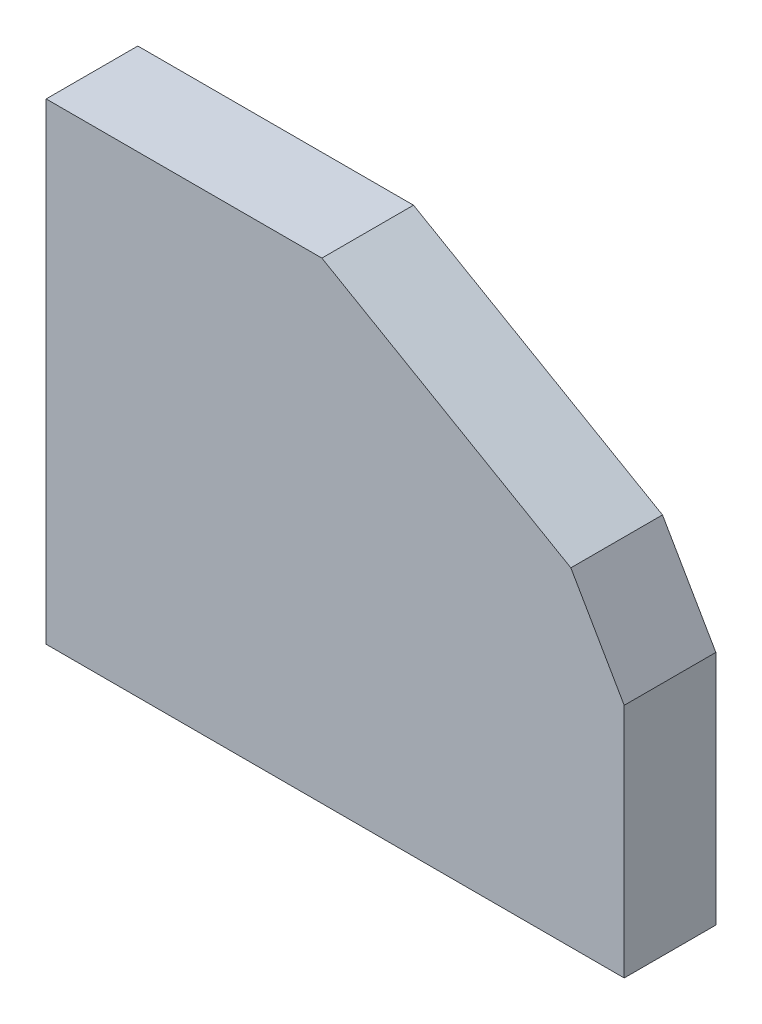
ISO-10303-21;
HEADER;
FILE_DESCRIPTION(('STEP AP214'),'2;1');
FILE_NAME('part.step','',(''),(''),'','','');
FILE_SCHEMA(('AUTOMOTIVE_DESIGN { 1 0 10303 214 1 1 1 1 }'));
ENDSEC;
DATA;
#1=APPLICATION_CONTEXT('core data for automotive mechanical design processes');
#2=APPLICATION_PROTOCOL_DEFINITION('international standard','automotive_design',2000,#1);
#3=PRODUCT_CONTEXT('',#1,'mechanical');
#4=PRODUCT('Part','Part','',(#3));
#5=PRODUCT_RELATED_PRODUCT_CATEGORY('part','',(#4));
#6=PRODUCT_DEFINITION_FORMATION('','',#4);
#7=PRODUCT_DEFINITION_CONTEXT('part definition',#1,'design');
#8=PRODUCT_DEFINITION('design','',#6,#7);
#9=PRODUCT_DEFINITION_SHAPE('','',#8);
#10=(LENGTH_UNIT() NAMED_UNIT(*) SI_UNIT(.MILLI.,.METRE.));
#11=(NAMED_UNIT(*) PLANE_ANGLE_UNIT() SI_UNIT($,.RADIAN.));
#12=(NAMED_UNIT(*) SI_UNIT($,.STERADIAN.) SOLID_ANGLE_UNIT());
#13=UNCERTAINTY_MEASURE_WITH_UNIT(LENGTH_MEASURE(1.E-05),#10,'distance_accuracy_value','');
#14=(GEOMETRIC_REPRESENTATION_CONTEXT(3) GLOBAL_UNCERTAINTY_ASSIGNED_CONTEXT((#13)) GLOBAL_UNIT_ASSIGNED_CONTEXT((#10,
#11,#12)) REPRESENTATION_CONTEXT('',''));
#15=CARTESIAN_POINT('',(0.,0.,0.));
#16=DIRECTION('',(0.,0.,1.));
#17=DIRECTION('',(1.,0.,0.));
#18=AXIS2_PLACEMENT_3D('',#15,#16,#17);
#19=CARTESIAN_POINT('',(41.,-33.5,13.));
#20=DIRECTION('',(-1.,0.,0.));
#21=DIRECTION('',(0.,-1.,0.));
#22=AXIS2_PLACEMENT_3D('',#19,#20,#21);
#23=PLANE('',#22);
#24=DIRECTION('',(0.,1.,0.));
#25=VECTOR('',#24,1.);
#26=CARTESIAN_POINT('',(41.,-33.5,0.));
#27=LINE('',#26,#25);
#28=CARTESIAN_POINT('',(41.,-33.5,0.));
#29=VERTEX_POINT('',#28);
#30=CARTESIAN_POINT('',(41.,0.,0.));
#31=VERTEX_POINT('',#30);
#32=EDGE_CURVE('E115',#29,#31,#27,.T.);
#33=ORIENTED_EDGE('',*,*,#32,.T.);
#34=DIRECTION('',(0.,0.,-1.));
#35=VECTOR('',#34,1.);
#36=CARTESIAN_POINT('',(41.,0.,13.));
#37=LINE('',#36,#35);
#38=CARTESIAN_POINT('',(41.,0.,13.));
#39=VERTEX_POINT('',#38);
#40=EDGE_CURVE('E11',#39,#31,#37,.T.);
#41=ORIENTED_EDGE('',*,*,#40,.F.);
#42=DIRECTION('',(0.,1.,0.));
#43=VECTOR('',#42,1.);
#44=CARTESIAN_POINT('',(41.,-33.5,13.));
#45=LINE('',#44,#43);
#46=CARTESIAN_POINT('',(41.,-33.5,13.));
#47=VERTEX_POINT('',#46);
#48=EDGE_CURVE('E80',#47,#39,#45,.T.);
#49=ORIENTED_EDGE('',*,*,#48,.F.);
#50=DIRECTION('',(0.,0.,-1.));
#51=VECTOR('',#50,1.);
#52=CARTESIAN_POINT('',(41.,-33.5,13.));
#53=LINE('',#52,#51);
#54=EDGE_CURVE('E49',#47,#29,#53,.T.);
#55=ORIENTED_EDGE('',*,*,#54,.T.);
#56=EDGE_LOOP('',(#33,#41,#49,#55));
#57=FACE_BOUND('',#56,.T.);
#58=ADVANCED_FACE('F33',(#57),#23,.F.);
#59=CARTESIAN_POINT('',(33.431867575506,13.1083898776333,13.));
#60=DIRECTION('',(0.866025403784442,0.499999999999995,0.));
#61=DIRECTION('',(-0.499999999999995,0.866025403784442,0.));
#62=AXIS2_PLACEMENT_3D('',#59,#60,#61);
#63=PLANE('',#62);
#64=DIRECTION('',(0.499999999999995,-0.866025403784442,0.));
#65=VECTOR('',#64,1.);
#66=CARTESIAN_POINT('',(33.431867575506,13.1083898776333,0.));
#67=LINE('',#66,#65);
#68=CARTESIAN_POINT('',(33.431867575506,13.1083898776333,0.));
#69=VERTEX_POINT('',#68);
#70=EDGE_CURVE('E117',#69,#31,#67,.T.);
#71=ORIENTED_EDGE('',*,*,#70,.F.);
#72=DIRECTION('',(0.,0.,-1.));
#73=VECTOR('',#72,1.);
#74=CARTESIAN_POINT('',(33.431867575506,13.1083898776333,13.));
#75=LINE('',#74,#73);
#76=CARTESIAN_POINT('',(33.431867575506,13.1083898776333,13.));
#77=VERTEX_POINT('',#76);
#78=EDGE_CURVE('E41',#77,#69,#75,.T.);
#79=ORIENTED_EDGE('',*,*,#78,.F.);
#80=DIRECTION('',(0.499999999999995,-0.866025403784442,0.));
#81=VECTOR('',#80,1.);
#82=CARTESIAN_POINT('',(33.431867575506,13.1083898776333,13.));
#83=LINE('',#82,#81);
#84=EDGE_CURVE('E154',#77,#39,#83,.T.);
#85=ORIENTED_EDGE('',*,*,#84,.T.);
#86=ORIENTED_EDGE('',*,*,#40,.T.);
#87=EDGE_LOOP('',(#71,#79,#85,#86));
#88=FACE_BOUND('',#87,.T.);
#89=ADVANCED_FACE('F137',(#88),#63,.T.);
#90=CARTESIAN_POINT('',(-1.88743720456944,33.5,13.));
#91=DIRECTION('',(0.499999999999995,0.866025403784442,0.));
#92=DIRECTION('',(-0.866025403784442,0.499999999999995,0.));
#93=AXIS2_PLACEMENT_3D('',#90,#91,#92);
#94=PLANE('',#93);
#95=DIRECTION('',(0.866025403784442,-0.499999999999995,0.));
#96=VECTOR('',#95,1.);
#97=CARTESIAN_POINT('',(-1.88743720456944,33.5,0.));
#98=LINE('',#97,#96);
#99=CARTESIAN_POINT('',(-1.88743720456944,33.5,0.));
#100=VERTEX_POINT('',#99);
#101=EDGE_CURVE('E120',#100,#69,#98,.T.);
#102=ORIENTED_EDGE('',*,*,#101,.F.);
#103=DIRECTION('',(0.,0.,-1.));
#104=VECTOR('',#103,1.);
#105=CARTESIAN_POINT('',(-1.88743720456944,33.5,13.));
#106=LINE('',#105,#104);
#107=CARTESIAN_POINT('',(-1.88743720456944,33.5,13.));
#108=VERTEX_POINT('',#107);
#109=EDGE_CURVE('E107',#108,#100,#106,.T.);
#110=ORIENTED_EDGE('',*,*,#109,.F.);
#111=DIRECTION('',(0.866025403784442,-0.499999999999995,0.));
#112=VECTOR('',#111,1.);
#113=CARTESIAN_POINT('',(-1.88743720456944,33.5,13.));
#114=LINE('',#113,#112);
#115=EDGE_CURVE('E97',#108,#77,#114,.T.);
#116=ORIENTED_EDGE('',*,*,#115,.T.);
#117=ORIENTED_EDGE('',*,*,#78,.T.);
#118=EDGE_LOOP('',(#102,#110,#116,#117));
#119=FACE_BOUND('',#118,.T.);
#120=ADVANCED_FACE('F134',(#119),#94,.T.);
#121=CARTESIAN_POINT('',(-1.88743720456944,33.5,13.));
#122=DIRECTION('',(0.,-1.,0.));
#123=DIRECTION('',(0.,0.,-1.));
#124=AXIS2_PLACEMENT_3D('',#121,#122,#123);
#125=PLANE('',#124);
#126=DIRECTION('',(-1.,0.,0.));
#127=VECTOR('',#126,1.);
#128=CARTESIAN_POINT('',(-1.88743720456944,33.5,0.));
#129=LINE('',#128,#127);
#130=CARTESIAN_POINT('',(-41.,33.5,0.));
#131=VERTEX_POINT('',#130);
#132=EDGE_CURVE('E104',#100,#131,#129,.T.);
#133=ORIENTED_EDGE('',*,*,#132,.T.);
#134=DIRECTION('',(0.,0.,-1.));
#135=VECTOR('',#134,1.);
#136=CARTESIAN_POINT('',(-41.,33.5,13.));
#137=LINE('',#136,#135);
#138=CARTESIAN_POINT('',(-41.,33.5,13.));
#139=VERTEX_POINT('',#138);
#140=EDGE_CURVE('E101',#139,#131,#137,.T.);
#141=ORIENTED_EDGE('',*,*,#140,.F.);
#142=DIRECTION('',(-1.,0.,0.));
#143=VECTOR('',#142,1.);
#144=CARTESIAN_POINT('',(-1.88743720456944,33.5,13.));
#145=LINE('',#144,#143);
#146=EDGE_CURVE('E91',#108,#139,#145,.T.);
#147=ORIENTED_EDGE('',*,*,#146,.F.);
#148=ORIENTED_EDGE('',*,*,#109,.T.);
#149=EDGE_LOOP('',(#133,#141,#147,#148));
#150=FACE_BOUND('',#149,.T.);
#151=ADVANCED_FACE('F102',(#150),#125,.F.);
#152=CARTESIAN_POINT('',(-41.,-33.5,13.));
#153=DIRECTION('',(-1.,0.,0.));
#154=DIRECTION('',(0.,0.,1.));
#155=AXIS2_PLACEMENT_3D('',#152,#153,#154);
#156=PLANE('',#155);
#157=DIRECTION('',(0.,1.,0.));
#158=VECTOR('',#157,1.);
#159=CARTESIAN_POINT('',(-41.,-33.5,0.));
#160=LINE('',#159,#158);
#161=CARTESIAN_POINT('',(-41.,-33.5,0.));
#162=VERTEX_POINT('',#161);
#163=EDGE_CURVE('E124',#162,#131,#160,.T.);
#164=ORIENTED_EDGE('',*,*,#163,.F.);
#165=DIRECTION('',(0.,0.,-1.));
#166=VECTOR('',#165,1.);
#167=CARTESIAN_POINT('',(-41.,-33.5,13.));
#168=LINE('',#167,#166);
#169=CARTESIAN_POINT('',(-41.,-33.5,13.));
#170=VERTEX_POINT('',#169);
#171=EDGE_CURVE('E68',#170,#162,#168,.T.);
#172=ORIENTED_EDGE('',*,*,#171,.F.);
#173=DIRECTION('',(0.,1.,0.));
#174=VECTOR('',#173,1.);
#175=CARTESIAN_POINT('',(-41.,-33.5,13.));
#176=LINE('',#175,#174);
#177=EDGE_CURVE('E95',#170,#139,#176,.T.);
#178=ORIENTED_EDGE('',*,*,#177,.T.);
#179=ORIENTED_EDGE('',*,*,#140,.T.);
#180=EDGE_LOOP('',(#164,#172,#178,#179));
#181=FACE_BOUND('',#180,.T.);
#182=ADVANCED_FACE('F109',(#181),#156,.T.);
#183=CARTESIAN_POINT('',(41.,-33.5,13.));
#184=DIRECTION('',(0.,-1.,0.));
#185=DIRECTION('',(1.,0.,0.));
#186=AXIS2_PLACEMENT_3D('',#183,#184,#185);
#187=PLANE('',#186);
#188=DIRECTION('',(-1.,0.,0.));
#189=VECTOR('',#188,1.);
#190=CARTESIAN_POINT('',(41.,-33.5,0.));
#191=LINE('',#190,#189);
#192=EDGE_CURVE('E126',#29,#162,#191,.T.);
#193=ORIENTED_EDGE('',*,*,#192,.F.);
#194=ORIENTED_EDGE('',*,*,#54,.F.);
#195=DIRECTION('',(-1.,0.,0.));
#196=VECTOR('',#195,1.);
#197=CARTESIAN_POINT('',(41.,-33.5,13.));
#198=LINE('',#197,#196);
#199=EDGE_CURVE('E110',#47,#170,#198,.T.);
#200=ORIENTED_EDGE('',*,*,#199,.T.);
#201=ORIENTED_EDGE('',*,*,#171,.T.);
#202=EDGE_LOOP('',(#193,#194,#200,#201));
#203=FACE_BOUND('',#202,.T.);
#204=ADVANCED_FACE('F140',(#203),#187,.T.);
#205=CARTESIAN_POINT('',(0.,0.,13.));
#206=DIRECTION('',(0.,0.,1.));
#207=DIRECTION('',(1.,0.,0.));
#208=AXIS2_PLACEMENT_3D('',#205,#206,#207);
#209=PLANE('',#208);
#210=ORIENTED_EDGE('',*,*,#48,.T.);
#211=ORIENTED_EDGE('',*,*,#84,.F.);
#212=ORIENTED_EDGE('',*,*,#115,.F.);
#213=ORIENTED_EDGE('',*,*,#146,.T.);
#214=ORIENTED_EDGE('',*,*,#177,.F.);
#215=ORIENTED_EDGE('',*,*,#199,.F.);
#216=EDGE_LOOP('',(#210,#211,#212,#213,#214,#215));
#217=FACE_BOUND('',#216,.T.);
#218=ADVANCED_FACE('F93',(#217),#209,.T.);
#219=CARTESIAN_POINT('',(0.,0.,0.));
#220=DIRECTION('',(0.,0.,1.));
#221=DIRECTION('',(1.,0.,0.));
#222=AXIS2_PLACEMENT_3D('',#219,#220,#221);
#223=PLANE('',#222);
#224=ORIENTED_EDGE('',*,*,#32,.F.);
#225=ORIENTED_EDGE('',*,*,#192,.T.);
#226=ORIENTED_EDGE('',*,*,#163,.T.);
#227=ORIENTED_EDGE('',*,*,#132,.F.);
#228=ORIENTED_EDGE('',*,*,#101,.T.);
#229=ORIENTED_EDGE('',*,*,#70,.T.);
#230=EDGE_LOOP('',(#224,#225,#226,#227,#228,#229));
#231=FACE_BOUND('',#230,.T.);
#232=ADVANCED_FACE('F139',(#231),#223,.F.);
#233=CLOSED_SHELL('',(#58,#89,#120,#151,#182,#204,#218,#232));
#234=MANIFOLD_SOLID_BREP('B2',#233);
#235=ADVANCED_BREP_SHAPE_REPRESENTATION('',(#18,#234),#14);
#236=SHAPE_DEFINITION_REPRESENTATION(#9,#235);
ENDSEC;
END-ISO-10303-21;
